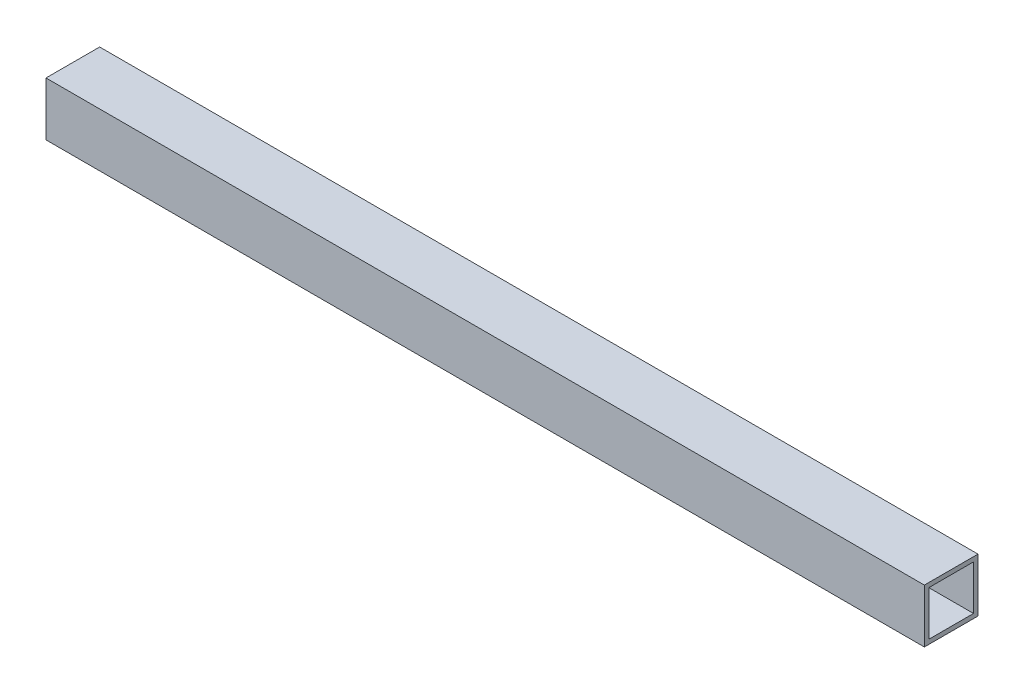
ISO-10303-21;
HEADER;
FILE_DESCRIPTION(('STEP AP214'),'2;1');
FILE_NAME('part.step','',(''),(''),'','','');
FILE_SCHEMA(('AUTOMOTIVE_DESIGN { 1 0 10303 214 1 1 1 1 }'));
ENDSEC;
DATA;
#1=APPLICATION_CONTEXT('core data for automotive mechanical design processes');
#2=APPLICATION_PROTOCOL_DEFINITION('international standard','automotive_design',2000,#1);
#3=PRODUCT_CONTEXT('',#1,'mechanical');
#4=PRODUCT('Part','Part','',(#3));
#5=PRODUCT_RELATED_PRODUCT_CATEGORY('part','',(#4));
#6=PRODUCT_DEFINITION_FORMATION('','',#4);
#7=PRODUCT_DEFINITION_CONTEXT('part definition',#1,'design');
#8=PRODUCT_DEFINITION('design','',#6,#7);
#9=PRODUCT_DEFINITION_SHAPE('','',#8);
#10=(LENGTH_UNIT() NAMED_UNIT(*) SI_UNIT(.MILLI.,.METRE.));
#11=(NAMED_UNIT(*) PLANE_ANGLE_UNIT() SI_UNIT($,.RADIAN.));
#12=(NAMED_UNIT(*) SI_UNIT($,.STERADIAN.) SOLID_ANGLE_UNIT());
#13=UNCERTAINTY_MEASURE_WITH_UNIT(LENGTH_MEASURE(1.E-05),#10,'distance_accuracy_value','');
#14=(GEOMETRIC_REPRESENTATION_CONTEXT(3) GLOBAL_UNCERTAINTY_ASSIGNED_CONTEXT((#13)) GLOBAL_UNIT_ASSIGNED_CONTEXT((#10,
#11,#12)) REPRESENTATION_CONTEXT('',''));
#15=CARTESIAN_POINT('',(0.,0.,0.));
#16=DIRECTION('',(0.,0.,1.));
#17=DIRECTION('',(1.,0.,0.));
#18=AXIS2_PLACEMENT_3D('',#15,#16,#17);
#19=CARTESIAN_POINT('',(-644.302928600729,80.8934504351239,769.632848364579));
#20=DIRECTION('',(0.,-1.,0.));
#21=DIRECTION('',(0.,0.,-1.));
#22=AXIS2_PLACEMENT_3D('',#19,#20,#21);
#23=PLANE('',#22);
#24=DIRECTION('',(0.,0.,1.));
#25=VECTOR('',#24,1.);
#26=CARTESIAN_POINT('',(-671.243696963937,80.8934504351239,769.632848364579));
#27=LINE('',#26,#25);
#28=CARTESIAN_POINT('',(-671.243696963937,80.8934504351239,750.582848364579));
#29=VERTEX_POINT('',#28);
#30=CARTESIAN_POINT('',(-671.243696963937,80.8934504351239,769.632848364579));
#31=VERTEX_POINT('',#30);
#32=EDGE_CURVE('E11',#29,#31,#27,.T.);
#33=ORIENTED_EDGE('',*,*,#32,.F.);
#34=DIRECTION('',(-1.,0.,0.));
#35=VECTOR('',#34,1.);
#36=CARTESIAN_POINT('',(-644.302928600729,80.8934504351239,750.582848364579));
#37=LINE('',#36,#35);
#38=CARTESIAN_POINT('',(-983.143696963937,80.8934504351239,750.582848364579));
#39=VERTEX_POINT('',#38);
#40=EDGE_CURVE('E143',#29,#39,#37,.T.);
#41=ORIENTED_EDGE('',*,*,#40,.T.);
#42=DIRECTION('',(0.,0.,1.));
#43=VECTOR('',#42,1.);
#44=CARTESIAN_POINT('',(-983.143696963937,80.8934504351239,769.632848364579));
#45=LINE('',#44,#43);
#46=CARTESIAN_POINT('',(-983.143696963937,80.8934504351239,769.632848364579));
#47=VERTEX_POINT('',#46);
#48=EDGE_CURVE('E138',#39,#47,#45,.T.);
#49=ORIENTED_EDGE('',*,*,#48,.T.);
#50=DIRECTION('',(-1.,0.,0.));
#51=VECTOR('',#50,1.);
#52=CARTESIAN_POINT('',(-644.302928600729,80.8934504351239,769.632848364579));
#53=LINE('',#52,#51);
#54=EDGE_CURVE('E141',#31,#47,#53,.T.);
#55=ORIENTED_EDGE('',*,*,#54,.F.);
#56=EDGE_LOOP('',(#33,#41,#49,#55));
#57=FACE_BOUND('',#56,.T.);
#58=ADVANCED_FACE('F32',(#57),#23,.F.);
#59=CARTESIAN_POINT('',(-644.302928600729,80.8934504351239,750.582848364579));
#60=DIRECTION('',(0.,0.,1.));
#61=DIRECTION('',(1.,0.,0.));
#62=AXIS2_PLACEMENT_3D('',#59,#60,#61);
#63=PLANE('',#62);
#64=DIRECTION('',(0.,1.,0.));
#65=VECTOR('',#64,1.);
#66=CARTESIAN_POINT('',(-671.243696963937,80.8934504351239,750.582848364579));
#67=LINE('',#66,#65);
#68=CARTESIAN_POINT('',(-671.243696963937,61.8434504351239,750.582848364579));
#69=VERTEX_POINT('',#68);
#70=EDGE_CURVE('E151',#69,#29,#67,.T.);
#71=ORIENTED_EDGE('',*,*,#70,.F.);
#72=DIRECTION('',(-1.,0.,0.));
#73=VECTOR('',#72,1.);
#74=CARTESIAN_POINT('',(-644.302928600729,61.8434504351239,750.582848364579));
#75=LINE('',#74,#73);
#76=CARTESIAN_POINT('',(-983.143696963937,61.8434504351239,750.582848364579));
#77=VERTEX_POINT('',#76);
#78=EDGE_CURVE('E145',#69,#77,#75,.T.);
#79=ORIENTED_EDGE('',*,*,#78,.T.);
#80=DIRECTION('',(0.,1.,0.));
#81=VECTOR('',#80,1.);
#82=CARTESIAN_POINT('',(-983.143696963937,80.8934504351239,750.582848364579));
#83=LINE('',#82,#81);
#84=EDGE_CURVE('E135',#77,#39,#83,.T.);
#85=ORIENTED_EDGE('',*,*,#84,.T.);
#86=ORIENTED_EDGE('',*,*,#40,.F.);
#87=EDGE_LOOP('',(#71,#79,#85,#86));
#88=FACE_BOUND('',#87,.T.);
#89=ADVANCED_FACE('F176',(#88),#63,.F.);
#90=CARTESIAN_POINT('',(-644.302928600729,61.8434504351239,769.632848364579));
#91=DIRECTION('',(0.,1.,0.));
#92=DIRECTION('',(0.,0.,1.));
#93=AXIS2_PLACEMENT_3D('',#90,#91,#92);
#94=PLANE('',#93);
#95=DIRECTION('',(0.,0.,-1.));
#96=VECTOR('',#95,1.);
#97=CARTESIAN_POINT('',(-671.243696963937,61.8434504351239,769.632848364579));
#98=LINE('',#97,#96);
#99=CARTESIAN_POINT('',(-671.243696963937,61.8434504351239,769.632848364579));
#100=VERTEX_POINT('',#99);
#101=EDGE_CURVE('E36',#100,#69,#98,.T.);
#102=ORIENTED_EDGE('',*,*,#101,.F.);
#103=DIRECTION('',(-1.,0.,0.));
#104=VECTOR('',#103,1.);
#105=CARTESIAN_POINT('',(-644.302928600729,61.8434504351239,769.632848364579));
#106=LINE('',#105,#104);
#107=CARTESIAN_POINT('',(-983.143696963937,61.8434504351239,769.632848364579));
#108=VERTEX_POINT('',#107);
#109=EDGE_CURVE('E147',#100,#108,#106,.T.);
#110=ORIENTED_EDGE('',*,*,#109,.T.);
#111=DIRECTION('',(0.,0.,-1.));
#112=VECTOR('',#111,1.);
#113=CARTESIAN_POINT('',(-983.143696963937,61.8434504351239,769.632848364579));
#114=LINE('',#113,#112);
#115=EDGE_CURVE('E132',#108,#77,#114,.T.);
#116=ORIENTED_EDGE('',*,*,#115,.T.);
#117=ORIENTED_EDGE('',*,*,#78,.F.);
#118=EDGE_LOOP('',(#102,#110,#116,#117));
#119=FACE_BOUND('',#118,.T.);
#120=ADVANCED_FACE('F182',(#119),#94,.F.);
#121=CARTESIAN_POINT('',(-644.302928600729,80.8934504351239,769.632848364579));
#122=DIRECTION('',(0.,0.,-1.));
#123=DIRECTION('',(-1.,0.,0.));
#124=AXIS2_PLACEMENT_3D('',#121,#122,#123);
#125=PLANE('',#124);
#126=DIRECTION('',(0.,-1.,0.));
#127=VECTOR('',#126,1.);
#128=CARTESIAN_POINT('',(-671.243696963937,80.8934504351239,769.632848364579));
#129=LINE('',#128,#127);
#130=EDGE_CURVE('E47',#31,#100,#129,.T.);
#131=ORIENTED_EDGE('',*,*,#130,.F.);
#132=ORIENTED_EDGE('',*,*,#54,.T.);
#133=DIRECTION('',(0.,-1.,0.));
#134=VECTOR('',#133,1.);
#135=CARTESIAN_POINT('',(-983.143696963937,80.8934504351239,769.632848364579));
#136=LINE('',#135,#134);
#137=EDGE_CURVE('E104',#47,#108,#136,.T.);
#138=ORIENTED_EDGE('',*,*,#137,.T.);
#139=ORIENTED_EDGE('',*,*,#109,.F.);
#140=EDGE_LOOP('',(#131,#132,#138,#139));
#141=FACE_BOUND('',#140,.T.);
#142=ADVANCED_FACE('F34',(#141),#125,.F.);
#143=CARTESIAN_POINT('',(-983.143696963937,0.,0.));
#144=DIRECTION('',(1.,0.,0.));
#145=DIRECTION('',(0.,0.,-1.));
#146=AXIS2_PLACEMENT_3D('',#143,#144,#145);
#147=PLANE('',#146);
#148=ORIENTED_EDGE('',*,*,#137,.F.);
#149=ORIENTED_EDGE('',*,*,#48,.F.);
#150=ORIENTED_EDGE('',*,*,#84,.F.);
#151=ORIENTED_EDGE('',*,*,#115,.F.);
#152=EDGE_LOOP('',(#148,#149,#150,#151));
#153=FACE_BOUND('',#152,.T.);
#154=DIRECTION('',(0.,0.,1.));
#155=VECTOR('',#154,1.);
#156=CARTESIAN_POINT('',(-983.143696963937,79.3059504351239,768.045348364579));
#157=LINE('',#156,#155);
#158=CARTESIAN_POINT('',(-983.143696963937,79.3059504351239,752.170348364579));
#159=VERTEX_POINT('',#158);
#160=CARTESIAN_POINT('',(-983.143696963937,79.3059504351239,768.045348364579));
#161=VERTEX_POINT('',#160);
#162=EDGE_CURVE('E99',#159,#161,#157,.T.);
#163=ORIENTED_EDGE('',*,*,#162,.T.);
#164=DIRECTION('',(0.,-1.,0.));
#165=VECTOR('',#164,1.);
#166=CARTESIAN_POINT('',(-983.143696963937,79.3059504351239,768.045348364579));
#167=LINE('',#166,#165);
#168=CARTESIAN_POINT('',(-983.143696963937,63.4309504351239,768.045348364579));
#169=VERTEX_POINT('',#168);
#170=EDGE_CURVE('E108',#161,#169,#167,.T.);
#171=ORIENTED_EDGE('',*,*,#170,.T.);
#172=DIRECTION('',(0.,0.,-1.));
#173=VECTOR('',#172,1.);
#174=CARTESIAN_POINT('',(-983.143696963937,63.4309504351239,768.045348364579));
#175=LINE('',#174,#173);
#176=CARTESIAN_POINT('',(-983.143696963937,63.4309504351239,752.170348364579));
#177=VERTEX_POINT('',#176);
#178=EDGE_CURVE('E114',#169,#177,#175,.T.);
#179=ORIENTED_EDGE('',*,*,#178,.T.);
#180=DIRECTION('',(0.,1.,0.));
#181=VECTOR('',#180,1.);
#182=CARTESIAN_POINT('',(-983.143696963937,79.3059504351239,752.170348364579));
#183=LINE('',#182,#181);
#184=EDGE_CURVE('E118',#177,#159,#183,.T.);
#185=ORIENTED_EDGE('',*,*,#184,.T.);
#186=EDGE_LOOP('',(#163,#171,#179,#185));
#187=FACE_BOUND('',#186,.T.);
#188=ADVANCED_FACE('F116',(#153,#187),#147,.F.);
#189=CARTESIAN_POINT('',(-644.302928600729,79.3059504351239,752.170348364579));
#190=DIRECTION('',(0.,0.,1.));
#191=DIRECTION('',(1.,0.,0.));
#192=AXIS2_PLACEMENT_3D('',#189,#190,#191);
#193=PLANE('',#192);
#194=DIRECTION('',(-1.,0.,0.));
#195=VECTOR('',#194,1.);
#196=CARTESIAN_POINT('',(-644.302928600729,63.4309504351239,752.170348364579));
#197=LINE('',#196,#195);
#198=CARTESIAN_POINT('',(-671.243696963937,63.4309504351239,752.170348364579));
#199=VERTEX_POINT('',#198);
#200=EDGE_CURVE('E127',#199,#177,#197,.T.);
#201=ORIENTED_EDGE('',*,*,#200,.F.);
#202=DIRECTION('',(0.,1.,0.));
#203=VECTOR('',#202,1.);
#204=CARTESIAN_POINT('',(-671.243696963937,79.3059504351239,752.170348364579));
#205=LINE('',#204,#203);
#206=CARTESIAN_POINT('',(-671.243696963937,79.3059504351239,752.170348364579));
#207=VERTEX_POINT('',#206);
#208=EDGE_CURVE('E149',#199,#207,#205,.T.);
#209=ORIENTED_EDGE('',*,*,#208,.T.);
#210=DIRECTION('',(-1.,0.,0.));
#211=VECTOR('',#210,1.);
#212=CARTESIAN_POINT('',(-644.302928600729,79.3059504351239,752.170348364579));
#213=LINE('',#212,#211);
#214=EDGE_CURVE('E125',#207,#159,#213,.T.);
#215=ORIENTED_EDGE('',*,*,#214,.T.);
#216=ORIENTED_EDGE('',*,*,#184,.F.);
#217=EDGE_LOOP('',(#201,#209,#215,#216));
#218=FACE_BOUND('',#217,.T.);
#219=ADVANCED_FACE('F164',(#218),#193,.T.);
#220=CARTESIAN_POINT('',(-644.302928600729,63.4309504351239,768.045348364579));
#221=DIRECTION('',(0.,1.,0.));
#222=DIRECTION('',(0.,0.,1.));
#223=AXIS2_PLACEMENT_3D('',#220,#221,#222);
#224=PLANE('',#223);
#225=DIRECTION('',(-1.,0.,0.));
#226=VECTOR('',#225,1.);
#227=CARTESIAN_POINT('',(-644.302928600729,63.4309504351239,768.045348364579));
#228=LINE('',#227,#226);
#229=CARTESIAN_POINT('',(-671.243696963937,63.4309504351239,768.045348364579));
#230=VERTEX_POINT('',#229);
#231=EDGE_CURVE('E105',#230,#169,#228,.T.);
#232=ORIENTED_EDGE('',*,*,#231,.F.);
#233=DIRECTION('',(0.,0.,-1.));
#234=VECTOR('',#233,1.);
#235=CARTESIAN_POINT('',(-671.243696963937,63.4309504351239,768.045348364579));
#236=LINE('',#235,#234);
#237=EDGE_CURVE('E42',#230,#199,#236,.T.);
#238=ORIENTED_EDGE('',*,*,#237,.T.);
#239=ORIENTED_EDGE('',*,*,#200,.T.);
#240=ORIENTED_EDGE('',*,*,#178,.F.);
#241=EDGE_LOOP('',(#232,#238,#239,#240));
#242=FACE_BOUND('',#241,.T.);
#243=ADVANCED_FACE('F162',(#242),#224,.T.);
#244=CARTESIAN_POINT('',(-644.302928600729,79.3059504351239,768.045348364579));
#245=DIRECTION('',(0.,0.,-1.));
#246=DIRECTION('',(-1.,0.,0.));
#247=AXIS2_PLACEMENT_3D('',#244,#245,#246);
#248=PLANE('',#247);
#249=DIRECTION('',(-1.,0.,0.));
#250=VECTOR('',#249,1.);
#251=CARTESIAN_POINT('',(-644.302928600729,79.3059504351239,768.045348364579));
#252=LINE('',#251,#250);
#253=CARTESIAN_POINT('',(-671.243696963937,79.3059504351239,768.045348364579));
#254=VERTEX_POINT('',#253);
#255=EDGE_CURVE('E94',#254,#161,#252,.T.);
#256=ORIENTED_EDGE('',*,*,#255,.F.);
#257=DIRECTION('',(0.,-1.,0.));
#258=VECTOR('',#257,1.);
#259=CARTESIAN_POINT('',(-671.243696963937,79.3059504351239,768.045348364579));
#260=LINE('',#259,#258);
#261=EDGE_CURVE('E158',#254,#230,#260,.T.);
#262=ORIENTED_EDGE('',*,*,#261,.T.);
#263=ORIENTED_EDGE('',*,*,#231,.T.);
#264=ORIENTED_EDGE('',*,*,#170,.F.);
#265=EDGE_LOOP('',(#256,#262,#263,#264));
#266=FACE_BOUND('',#265,.T.);
#267=ADVANCED_FACE('F109',(#266),#248,.T.);
#268=CARTESIAN_POINT('',(-644.302928600729,79.3059504351239,768.045348364579));
#269=DIRECTION('',(0.,-1.,0.));
#270=DIRECTION('',(0.,0.,-1.));
#271=AXIS2_PLACEMENT_3D('',#268,#269,#270);
#272=PLANE('',#271);
#273=ORIENTED_EDGE('',*,*,#214,.F.);
#274=DIRECTION('',(0.,0.,1.));
#275=VECTOR('',#274,1.);
#276=CARTESIAN_POINT('',(-671.243696963937,79.3059504351239,768.045348364579));
#277=LINE('',#276,#275);
#278=EDGE_CURVE('E101',#207,#254,#277,.T.);
#279=ORIENTED_EDGE('',*,*,#278,.T.);
#280=ORIENTED_EDGE('',*,*,#255,.T.);
#281=ORIENTED_EDGE('',*,*,#162,.F.);
#282=EDGE_LOOP('',(#273,#279,#280,#281));
#283=FACE_BOUND('',#282,.T.);
#284=ADVANCED_FACE('F97',(#283),#272,.T.);
#285=CARTESIAN_POINT('',(-671.243696963937,80.8934504351239,402.217080001371));
#286=DIRECTION('',(1.,0.,0.));
#287=DIRECTION('',(0.,0.,-1.));
#288=AXIS2_PLACEMENT_3D('',#285,#286,#287);
#289=PLANE('',#288);
#290=ORIENTED_EDGE('',*,*,#208,.F.);
#291=ORIENTED_EDGE('',*,*,#237,.F.);
#292=ORIENTED_EDGE('',*,*,#261,.F.);
#293=ORIENTED_EDGE('',*,*,#278,.F.);
#294=EDGE_LOOP('',(#290,#291,#292,#293));
#295=FACE_BOUND('',#294,.T.);
#296=ORIENTED_EDGE('',*,*,#130,.T.);
#297=ORIENTED_EDGE('',*,*,#101,.T.);
#298=ORIENTED_EDGE('',*,*,#70,.T.);
#299=ORIENTED_EDGE('',*,*,#32,.T.);
#300=EDGE_LOOP('',(#296,#297,#298,#299));
#301=FACE_BOUND('',#300,.T.);
#302=ADVANCED_FACE('F200',(#295,#301),#289,.T.);
#303=CLOSED_SHELL('',(#58,#89,#120,#142,#188,#219,#243,#267,#284,#302));
#304=MANIFOLD_SOLID_BREP('B2',#303);
#305=ADVANCED_BREP_SHAPE_REPRESENTATION('',(#18,#304),#14);
#306=SHAPE_DEFINITION_REPRESENTATION(#9,#305);
ENDSEC;
END-ISO-10303-21;
